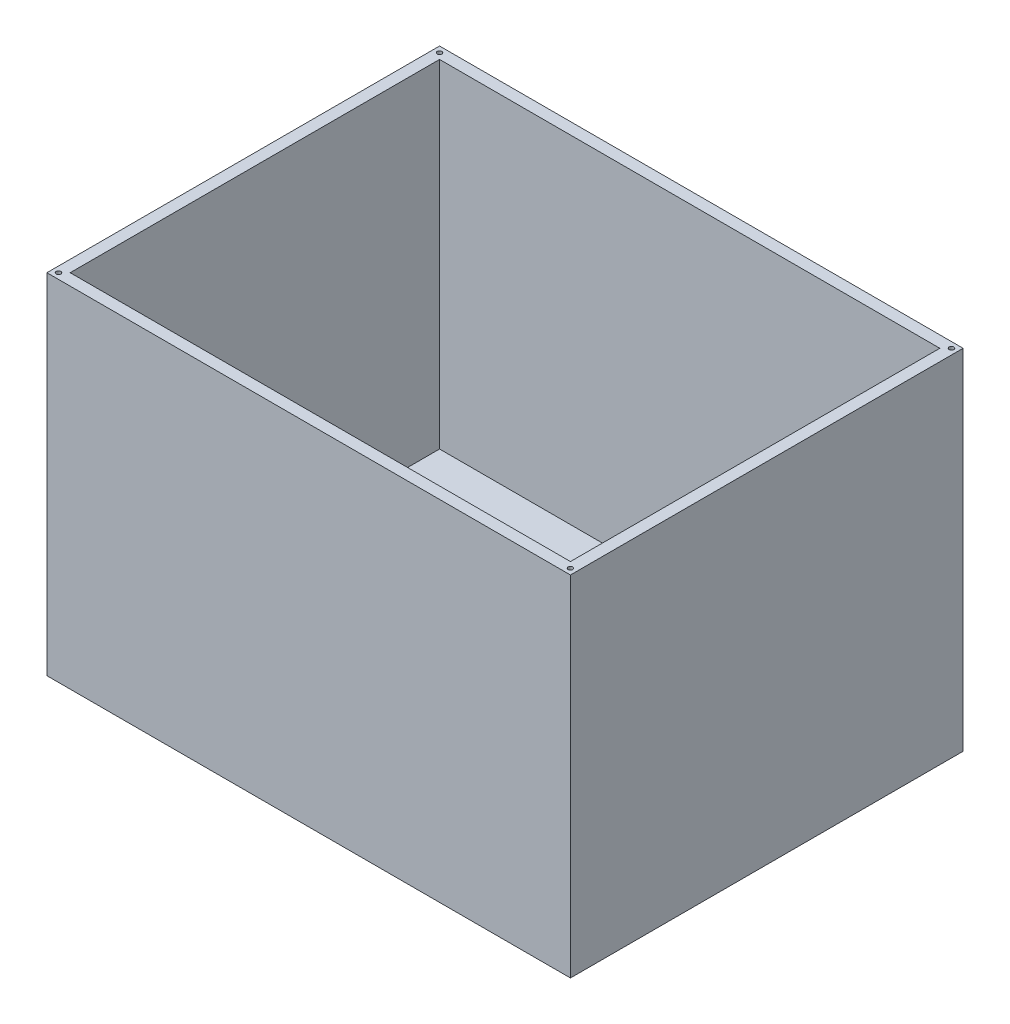
ISO-10303-21;
HEADER;
FILE_DESCRIPTION(('STEP AP214'),'2;1');
FILE_NAME('part.step','',(''),(''),'','','');
FILE_SCHEMA(('AUTOMOTIVE_DESIGN { 1 0 10303 214 1 1 1 1 }'));
ENDSEC;
DATA;
#1=APPLICATION_CONTEXT('core data for automotive mechanical design processes');
#2=APPLICATION_PROTOCOL_DEFINITION('international standard','automotive_design',2000,#1);
#3=PRODUCT_CONTEXT('',#1,'mechanical');
#4=PRODUCT('Part','Part','',(#3));
#5=PRODUCT_RELATED_PRODUCT_CATEGORY('part','',(#4));
#6=PRODUCT_DEFINITION_FORMATION('','',#4);
#7=PRODUCT_DEFINITION_CONTEXT('part definition',#1,'design');
#8=PRODUCT_DEFINITION('design','',#6,#7);
#9=PRODUCT_DEFINITION_SHAPE('','',#8);
#10=(LENGTH_UNIT() NAMED_UNIT(*) SI_UNIT(.MILLI.,.METRE.));
#11=(NAMED_UNIT(*) PLANE_ANGLE_UNIT() SI_UNIT($,.RADIAN.));
#12=(NAMED_UNIT(*) SI_UNIT($,.STERADIAN.) SOLID_ANGLE_UNIT());
#13=UNCERTAINTY_MEASURE_WITH_UNIT(LENGTH_MEASURE(1.E-05),#10,'distance_accuracy_value','');
#14=(GEOMETRIC_REPRESENTATION_CONTEXT(3) GLOBAL_UNCERTAINTY_ASSIGNED_CONTEXT((#13)) GLOBAL_UNIT_ASSIGNED_CONTEXT((#10,
#11,#12)) REPRESENTATION_CONTEXT('',''));
#15=CARTESIAN_POINT('',(0.,0.,0.));
#16=DIRECTION('',(0.,0.,1.));
#17=DIRECTION('',(1.,0.,0.));
#18=AXIS2_PLACEMENT_3D('',#15,#16,#17);
#19=CARTESIAN_POINT('',(450.,600.,-337.5));
#20=DIRECTION('',(-1.,0.,0.));
#21=DIRECTION('',(0.,0.,1.));
#22=AXIS2_PLACEMENT_3D('',#19,#20,#21);
#23=PLANE('',#22);
#24=DIRECTION('',(0.,0.,-1.));
#25=VECTOR('',#24,1.);
#26=CARTESIAN_POINT('',(450.,0.,-337.5));
#27=LINE('',#26,#25);
#28=CARTESIAN_POINT('',(450.,0.,337.5));
#29=VERTEX_POINT('',#28);
#30=CARTESIAN_POINT('',(450.,0.,-337.5));
#31=VERTEX_POINT('',#30);
#32=EDGE_CURVE('E147',#29,#31,#27,.T.);
#33=ORIENTED_EDGE('',*,*,#32,.T.);
#34=DIRECTION('',(0.,-1.,0.));
#35=VECTOR('',#34,1.);
#36=CARTESIAN_POINT('',(450.,600.,-337.5));
#37=LINE('',#36,#35);
#38=CARTESIAN_POINT('',(450.,600.,-337.5));
#39=VERTEX_POINT('',#38);
#40=EDGE_CURVE('E11',#39,#31,#37,.T.);
#41=ORIENTED_EDGE('',*,*,#40,.F.);
#42=DIRECTION('',(0.,0.,-1.));
#43=VECTOR('',#42,1.);
#44=CARTESIAN_POINT('',(450.,600.,-337.5));
#45=LINE('',#44,#43);
#46=CARTESIAN_POINT('',(450.,600.,337.5));
#47=VERTEX_POINT('',#46);
#48=EDGE_CURVE('E140',#47,#39,#45,.T.);
#49=ORIENTED_EDGE('',*,*,#48,.F.);
#50=DIRECTION('',(0.,-1.,0.));
#51=VECTOR('',#50,1.);
#52=CARTESIAN_POINT('',(450.,600.,337.5));
#53=LINE('',#52,#51);
#54=EDGE_CURVE('E146',#47,#29,#53,.T.);
#55=ORIENTED_EDGE('',*,*,#54,.T.);
#56=EDGE_LOOP('',(#33,#41,#49,#55));
#57=FACE_BOUND('',#56,.T.);
#58=ADVANCED_FACE('F33',(#57),#23,.F.);
#59=CARTESIAN_POINT('',(-450.,600.,-337.5));
#60=DIRECTION('',(0.,0.,1.));
#61=DIRECTION('',(1.,0.,0.));
#62=AXIS2_PLACEMENT_3D('',#59,#60,#61);
#63=PLANE('',#62);
#64=DIRECTION('',(-1.,0.,0.));
#65=VECTOR('',#64,1.);
#66=CARTESIAN_POINT('',(-450.,0.,-337.5));
#67=LINE('',#66,#65);
#68=CARTESIAN_POINT('',(-450.,0.,-337.5));
#69=VERTEX_POINT('',#68);
#70=EDGE_CURVE('E150',#31,#69,#67,.T.);
#71=ORIENTED_EDGE('',*,*,#70,.T.);
#72=DIRECTION('',(0.,-1.,0.));
#73=VECTOR('',#72,1.);
#74=CARTESIAN_POINT('',(-450.,600.,-337.5));
#75=LINE('',#74,#73);
#76=CARTESIAN_POINT('',(-450.,600.,-337.5));
#77=VERTEX_POINT('',#76);
#78=EDGE_CURVE('E40',#77,#69,#75,.T.);
#79=ORIENTED_EDGE('',*,*,#78,.F.);
#80=DIRECTION('',(-1.,0.,0.));
#81=VECTOR('',#80,1.);
#82=CARTESIAN_POINT('',(-450.,600.,-337.5));
#83=LINE('',#82,#81);
#84=EDGE_CURVE('E84',#39,#77,#83,.T.);
#85=ORIENTED_EDGE('',*,*,#84,.F.);
#86=ORIENTED_EDGE('',*,*,#40,.T.);
#87=EDGE_LOOP('',(#71,#79,#85,#86));
#88=FACE_BOUND('',#87,.T.);
#89=ADVANCED_FACE('F179',(#88),#63,.F.);
#90=CARTESIAN_POINT('',(-450.,600.,-337.5));
#91=DIRECTION('',(1.,0.,0.));
#92=DIRECTION('',(0.,0.,-1.));
#93=AXIS2_PLACEMENT_3D('',#90,#91,#92);
#94=PLANE('',#93);
#95=DIRECTION('',(0.,0.,1.));
#96=VECTOR('',#95,1.);
#97=CARTESIAN_POINT('',(-450.,0.,-337.5));
#98=LINE('',#97,#96);
#99=CARTESIAN_POINT('',(-450.,0.,337.5));
#100=VERTEX_POINT('',#99);
#101=EDGE_CURVE('E152',#69,#100,#98,.T.);
#102=ORIENTED_EDGE('',*,*,#101,.T.);
#103=DIRECTION('',(0.,-1.,0.));
#104=VECTOR('',#103,1.);
#105=CARTESIAN_POINT('',(-450.,600.,337.5));
#106=LINE('',#105,#104);
#107=CARTESIAN_POINT('',(-450.,600.,337.5));
#108=VERTEX_POINT('',#107);
#109=EDGE_CURVE('E156',#108,#100,#106,.T.);
#110=ORIENTED_EDGE('',*,*,#109,.F.);
#111=DIRECTION('',(0.,0.,1.));
#112=VECTOR('',#111,1.);
#113=CARTESIAN_POINT('',(-450.,600.,-337.5));
#114=LINE('',#113,#112);
#115=EDGE_CURVE('E143',#77,#108,#114,.T.);
#116=ORIENTED_EDGE('',*,*,#115,.F.);
#117=ORIENTED_EDGE('',*,*,#78,.T.);
#118=EDGE_LOOP('',(#102,#110,#116,#117));
#119=FACE_BOUND('',#118,.T.);
#120=ADVANCED_FACE('F161',(#119),#94,.F.);
#121=CARTESIAN_POINT('',(-450.,600.,337.5));
#122=DIRECTION('',(0.,0.,-1.));
#123=DIRECTION('',(-1.,0.,0.));
#124=AXIS2_PLACEMENT_3D('',#121,#122,#123);
#125=PLANE('',#124);
#126=DIRECTION('',(1.,0.,0.));
#127=VECTOR('',#126,1.);
#128=CARTESIAN_POINT('',(-450.,0.,337.5));
#129=LINE('',#128,#127);
#130=EDGE_CURVE('E77',#100,#29,#129,.T.);
#131=ORIENTED_EDGE('',*,*,#130,.T.);
#132=ORIENTED_EDGE('',*,*,#54,.F.);
#133=DIRECTION('',(1.,0.,0.));
#134=VECTOR('',#133,1.);
#135=CARTESIAN_POINT('',(-450.,600.,337.5));
#136=LINE('',#135,#134);
#137=EDGE_CURVE('E56',#108,#47,#136,.T.);
#138=ORIENTED_EDGE('',*,*,#137,.F.);
#139=ORIENTED_EDGE('',*,*,#109,.T.);
#140=EDGE_LOOP('',(#131,#132,#138,#139));
#141=FACE_BOUND('',#140,.T.);
#142=ADVANCED_FACE('F169',(#141),#125,.F.);
#143=CARTESIAN_POINT('',(0.,600.,0.));
#144=DIRECTION('',(0.,1.,0.));
#145=DIRECTION('',(0.,0.,1.));
#146=AXIS2_PLACEMENT_3D('',#143,#144,#145);
#147=PLANE('',#146);
#148=CARTESIAN_POINT('',(-440.,600.,-327.5));
#149=DIRECTION('',(0.,1.,0.));
#150=DIRECTION('',(0.,0.,1.));
#151=AXIS2_PLACEMENT_3D('',#148,#149,#150);
#152=CIRCLE('',#151,3.99999999999999);
#153=CARTESIAN_POINT('',(-440.,600.,-323.5));
#154=VERTEX_POINT('',#153);
#155=EDGE_CURVE('E340',#154,#154,#152,.T.);
#156=ORIENTED_EDGE('',*,*,#155,.F.);
#157=EDGE_LOOP('',(#156));
#158=FACE_BOUND('',#157,.T.);
#159=CARTESIAN_POINT('',(440.,600.,-327.5));
#160=DIRECTION('',(0.,1.,0.));
#161=DIRECTION('',(0.,0.,1.));
#162=AXIS2_PLACEMENT_3D('',#159,#160,#161);
#163=CIRCLE('',#162,3.99999999999999);
#164=CARTESIAN_POINT('',(440.,600.,-323.5));
#165=VERTEX_POINT('',#164);
#166=EDGE_CURVE('E339',#165,#165,#163,.T.);
#167=ORIENTED_EDGE('',*,*,#166,.F.);
#168=EDGE_LOOP('',(#167));
#169=FACE_BOUND('',#168,.T.);
#170=CARTESIAN_POINT('',(440.,600.,327.5));
#171=DIRECTION('',(0.,1.,0.));
#172=DIRECTION('',(0.,0.,1.));
#173=AXIS2_PLACEMENT_3D('',#170,#171,#172);
#174=CIRCLE('',#173,3.99999999999999);
#175=CARTESIAN_POINT('',(440.,600.,331.5));
#176=VERTEX_POINT('',#175);
#177=EDGE_CURVE('E349',#176,#176,#174,.T.);
#178=ORIENTED_EDGE('',*,*,#177,.F.);
#179=EDGE_LOOP('',(#178));
#180=FACE_BOUND('',#179,.T.);
#181=CARTESIAN_POINT('',(-440.,600.,327.5));
#182=DIRECTION('',(0.,1.,0.));
#183=DIRECTION('',(0.,0.,1.));
#184=AXIS2_PLACEMENT_3D('',#181,#182,#183);
#185=CIRCLE('',#184,3.99999999999999);
#186=CARTESIAN_POINT('',(-440.,600.,331.5));
#187=VERTEX_POINT('',#186);
#188=EDGE_CURVE('E354',#187,#187,#185,.T.);
#189=ORIENTED_EDGE('',*,*,#188,.F.);
#190=EDGE_LOOP('',(#189));
#191=FACE_BOUND('',#190,.T.);
#192=DIRECTION('',(0.,0.,-1.));
#193=VECTOR('',#192,1.);
#194=CARTESIAN_POINT('',(430.,600.,-337.5));
#195=LINE('',#194,#193);
#196=CARTESIAN_POINT('',(430.,600.,317.5));
#197=VERTEX_POINT('',#196);
#198=CARTESIAN_POINT('',(430.,600.,-317.5));
#199=VERTEX_POINT('',#198);
#200=EDGE_CURVE('E129',#197,#199,#195,.T.);
#201=ORIENTED_EDGE('',*,*,#200,.F.);
#202=DIRECTION('',(1.,0.,0.));
#203=VECTOR('',#202,1.);
#204=CARTESIAN_POINT('',(-450.,600.,317.5));
#205=LINE('',#204,#203);
#206=CARTESIAN_POINT('',(-430.,600.,317.5));
#207=VERTEX_POINT('',#206);
#208=EDGE_CURVE('E138',#207,#197,#205,.T.);
#209=ORIENTED_EDGE('',*,*,#208,.F.);
#210=DIRECTION('',(0.,0.,1.));
#211=VECTOR('',#210,1.);
#212=CARTESIAN_POINT('',(-430.,600.,-337.5));
#213=LINE('',#212,#211);
#214=CARTESIAN_POINT('',(-430.,600.,-317.5));
#215=VERTEX_POINT('',#214);
#216=EDGE_CURVE('E136',#215,#207,#213,.T.);
#217=ORIENTED_EDGE('',*,*,#216,.F.);
#218=DIRECTION('',(-1.,0.,0.));
#219=VECTOR('',#218,1.);
#220=CARTESIAN_POINT('',(-450.,600.,-317.5));
#221=LINE('',#220,#219);
#222=EDGE_CURVE('E121',#199,#215,#221,.T.);
#223=ORIENTED_EDGE('',*,*,#222,.F.);
#224=EDGE_LOOP('',(#201,#209,#217,#223));
#225=FACE_BOUND('',#224,.T.);
#226=ORIENTED_EDGE('',*,*,#48,.T.);
#227=ORIENTED_EDGE('',*,*,#84,.T.);
#228=ORIENTED_EDGE('',*,*,#115,.T.);
#229=ORIENTED_EDGE('',*,*,#137,.T.);
#230=EDGE_LOOP('',(#226,#227,#228,#229));
#231=FACE_BOUND('',#230,.T.);
#232=ADVANCED_FACE('F171',(#158,#169,#180,#191,#225,#231),#147,.T.);
#233=CARTESIAN_POINT('',(0.,0.,0.));
#234=DIRECTION('',(0.,1.,0.));
#235=DIRECTION('',(0.,0.,1.));
#236=AXIS2_PLACEMENT_3D('',#233,#234,#235);
#237=PLANE('',#236);
#238=ORIENTED_EDGE('',*,*,#32,.F.);
#239=ORIENTED_EDGE('',*,*,#130,.F.);
#240=ORIENTED_EDGE('',*,*,#101,.F.);
#241=ORIENTED_EDGE('',*,*,#70,.F.);
#242=EDGE_LOOP('',(#238,#239,#240,#241));
#243=FACE_BOUND('',#242,.T.);
#244=ADVANCED_FACE('F165',(#243),#237,.F.);
#245=CARTESIAN_POINT('',(430.,600.,-337.5));
#246=DIRECTION('',(-1.,0.,0.));
#247=DIRECTION('',(0.,0.,1.));
#248=AXIS2_PLACEMENT_3D('',#245,#246,#247);
#249=PLANE('',#248);
#250=DIRECTION('',(0.,0.,-1.));
#251=VECTOR('',#250,1.);
#252=CARTESIAN_POINT('',(430.,20.,-337.5));
#253=LINE('',#252,#251);
#254=CARTESIAN_POINT('',(430.,20.,317.5));
#255=VERTEX_POINT('',#254);
#256=CARTESIAN_POINT('',(430.,20.,-317.5));
#257=VERTEX_POINT('',#256);
#258=EDGE_CURVE('E112',#255,#257,#253,.T.);
#259=ORIENTED_EDGE('',*,*,#258,.F.);
#260=DIRECTION('',(0.,-1.,0.));
#261=VECTOR('',#260,1.);
#262=CARTESIAN_POINT('',(430.,600.,317.5));
#263=LINE('',#262,#261);
#264=EDGE_CURVE('E132',#197,#255,#263,.T.);
#265=ORIENTED_EDGE('',*,*,#264,.F.);
#266=ORIENTED_EDGE('',*,*,#200,.T.);
#267=DIRECTION('',(0.,-1.,0.));
#268=VECTOR('',#267,1.);
#269=CARTESIAN_POINT('',(430.,600.,-317.5));
#270=LINE('',#269,#268);
#271=EDGE_CURVE('E124',#199,#257,#270,.T.);
#272=ORIENTED_EDGE('',*,*,#271,.T.);
#273=EDGE_LOOP('',(#259,#265,#266,#272));
#274=FACE_BOUND('',#273,.T.);
#275=ADVANCED_FACE('F206',(#274),#249,.T.);
#276=CARTESIAN_POINT('',(-450.,600.,-317.5));
#277=DIRECTION('',(0.,0.,1.));
#278=DIRECTION('',(1.,0.,0.));
#279=AXIS2_PLACEMENT_3D('',#276,#277,#278);
#280=PLANE('',#279);
#281=DIRECTION('',(-1.,0.,0.));
#282=VECTOR('',#281,1.);
#283=CARTESIAN_POINT('',(-450.,20.,-317.5));
#284=LINE('',#283,#282);
#285=CARTESIAN_POINT('',(-430.,20.,-317.5));
#286=VERTEX_POINT('',#285);
#287=EDGE_CURVE('E106',#257,#286,#284,.T.);
#288=ORIENTED_EDGE('',*,*,#287,.F.);
#289=ORIENTED_EDGE('',*,*,#271,.F.);
#290=ORIENTED_EDGE('',*,*,#222,.T.);
#291=DIRECTION('',(0.,-1.,0.));
#292=VECTOR('',#291,1.);
#293=CARTESIAN_POINT('',(-430.,600.,-317.5));
#294=LINE('',#293,#292);
#295=EDGE_CURVE('E118',#215,#286,#294,.T.);
#296=ORIENTED_EDGE('',*,*,#295,.T.);
#297=EDGE_LOOP('',(#288,#289,#290,#296));
#298=FACE_BOUND('',#297,.T.);
#299=ADVANCED_FACE('F119',(#298),#280,.T.);
#300=CARTESIAN_POINT('',(-430.,600.,-337.5));
#301=DIRECTION('',(1.,0.,0.));
#302=DIRECTION('',(0.,0.,-1.));
#303=AXIS2_PLACEMENT_3D('',#300,#301,#302);
#304=PLANE('',#303);
#305=DIRECTION('',(0.,0.,1.));
#306=VECTOR('',#305,1.);
#307=CARTESIAN_POINT('',(-430.,20.,-337.5));
#308=LINE('',#307,#306);
#309=CARTESIAN_POINT('',(-430.,20.,317.5));
#310=VERTEX_POINT('',#309);
#311=EDGE_CURVE('E110',#286,#310,#308,.T.);
#312=ORIENTED_EDGE('',*,*,#311,.F.);
#313=ORIENTED_EDGE('',*,*,#295,.F.);
#314=ORIENTED_EDGE('',*,*,#216,.T.);
#315=DIRECTION('',(0.,-1.,0.));
#316=VECTOR('',#315,1.);
#317=CARTESIAN_POINT('',(-430.,600.,317.5));
#318=LINE('',#317,#316);
#319=EDGE_CURVE('E47',#207,#310,#318,.T.);
#320=ORIENTED_EDGE('',*,*,#319,.T.);
#321=EDGE_LOOP('',(#312,#313,#314,#320));
#322=FACE_BOUND('',#321,.T.);
#323=ADVANCED_FACE('F126',(#322),#304,.T.);
#324=CARTESIAN_POINT('',(-450.,600.,317.5));
#325=DIRECTION('',(0.,0.,-1.));
#326=DIRECTION('',(-1.,0.,0.));
#327=AXIS2_PLACEMENT_3D('',#324,#325,#326);
#328=PLANE('',#327);
#329=DIRECTION('',(1.,0.,0.));
#330=VECTOR('',#329,1.);
#331=CARTESIAN_POINT('',(-450.,20.,317.5));
#332=LINE('',#331,#330);
#333=EDGE_CURVE('E127',#310,#255,#332,.T.);
#334=ORIENTED_EDGE('',*,*,#333,.F.);
#335=ORIENTED_EDGE('',*,*,#319,.F.);
#336=ORIENTED_EDGE('',*,*,#208,.T.);
#337=ORIENTED_EDGE('',*,*,#264,.T.);
#338=EDGE_LOOP('',(#334,#335,#336,#337));
#339=FACE_BOUND('',#338,.T.);
#340=ADVANCED_FACE('F231',(#339),#328,.T.);
#341=CARTESIAN_POINT('',(0.,20.,0.));
#342=DIRECTION('',(0.,1.,0.));
#343=DIRECTION('',(0.,0.,1.));
#344=AXIS2_PLACEMENT_3D('',#341,#342,#343);
#345=PLANE('',#344);
#346=ORIENTED_EDGE('',*,*,#258,.T.);
#347=ORIENTED_EDGE('',*,*,#287,.T.);
#348=ORIENTED_EDGE('',*,*,#311,.T.);
#349=ORIENTED_EDGE('',*,*,#333,.T.);
#350=EDGE_LOOP('',(#346,#347,#348,#349));
#351=FACE_BOUND('',#350,.T.);
#352=ADVANCED_FACE('F108',(#351),#345,.T.);
#353=CARTESIAN_POINT('',(-440.,580.,327.5));
#354=DIRECTION('',(0.,1.,0.));
#355=DIRECTION('',(0.,0.,1.));
#356=AXIS2_PLACEMENT_3D('',#353,#354,#355);
#357=CYLINDRICAL_SURFACE('',#356,3.99999999999999);
#358=CARTESIAN_POINT('',(-440.,580.,327.5));
#359=DIRECTION('',(0.,1.,0.));
#360=DIRECTION('',(0.,0.,1.));
#361=AXIS2_PLACEMENT_3D('',#358,#359,#360);
#362=CIRCLE('',#361,3.99999999999999);
#363=CARTESIAN_POINT('',(-440.,580.,331.5));
#364=VERTEX_POINT('',#363);
#365=EDGE_CURVE('E357',#364,#364,#362,.T.);
#366=ORIENTED_EDGE('',*,*,#365,.F.);
#367=EDGE_LOOP('',(#366));
#368=FACE_BOUND('',#367,.T.);
#369=ORIENTED_EDGE('',*,*,#188,.T.);
#370=EDGE_LOOP('',(#369));
#371=FACE_BOUND('',#370,.T.);
#372=ADVANCED_FACE('F248',(#368,#371),#357,.F.);
#373=CARTESIAN_POINT('',(-440.,580.,327.5));
#374=DIRECTION('',(0.,1.,0.));
#375=DIRECTION('',(0.,0.,1.));
#376=AXIS2_PLACEMENT_3D('',#373,#374,#375);
#377=PLANE('',#376);
#378=ORIENTED_EDGE('',*,*,#365,.T.);
#379=EDGE_LOOP('',(#378));
#380=FACE_BOUND('',#379,.T.);
#381=ADVANCED_FACE('F257',(#380),#377,.T.);
#382=CARTESIAN_POINT('',(440.,580.,327.5));
#383=DIRECTION('',(0.,1.,0.));
#384=DIRECTION('',(0.,0.,1.));
#385=AXIS2_PLACEMENT_3D('',#382,#383,#384);
#386=CYLINDRICAL_SURFACE('',#385,3.99999999999999);
#387=CARTESIAN_POINT('',(440.,580.,327.5));
#388=DIRECTION('',(0.,1.,0.));
#389=DIRECTION('',(0.,0.,1.));
#390=AXIS2_PLACEMENT_3D('',#387,#388,#389);
#391=CIRCLE('',#390,3.99999999999999);
#392=CARTESIAN_POINT('',(440.,580.,331.5));
#393=VERTEX_POINT('',#392);
#394=EDGE_CURVE('E351',#393,#393,#391,.T.);
#395=ORIENTED_EDGE('',*,*,#394,.F.);
#396=EDGE_LOOP('',(#395));
#397=FACE_BOUND('',#396,.T.);
#398=ORIENTED_EDGE('',*,*,#177,.T.);
#399=EDGE_LOOP('',(#398));
#400=FACE_BOUND('',#399,.T.);
#401=ADVANCED_FACE('F267',(#397,#400),#386,.F.);
#402=CARTESIAN_POINT('',(440.,580.,327.5));
#403=DIRECTION('',(0.,1.,0.));
#404=DIRECTION('',(0.,0.,1.));
#405=AXIS2_PLACEMENT_3D('',#402,#403,#404);
#406=PLANE('',#405);
#407=ORIENTED_EDGE('',*,*,#394,.T.);
#408=EDGE_LOOP('',(#407));
#409=FACE_BOUND('',#408,.T.);
#410=ADVANCED_FACE('F277',(#409),#406,.T.);
#411=CARTESIAN_POINT('',(440.,580.,-327.5));
#412=DIRECTION('',(0.,1.,0.));
#413=DIRECTION('',(0.,0.,1.));
#414=AXIS2_PLACEMENT_3D('',#411,#412,#413);
#415=CYLINDRICAL_SURFACE('',#414,3.99999999999999);
#416=CARTESIAN_POINT('',(440.,580.,-327.5));
#417=DIRECTION('',(0.,1.,0.));
#418=DIRECTION('',(0.,0.,1.));
#419=AXIS2_PLACEMENT_3D('',#416,#417,#418);
#420=CIRCLE('',#419,3.99999999999999);
#421=CARTESIAN_POINT('',(440.,580.,-323.5));
#422=VERTEX_POINT('',#421);
#423=EDGE_CURVE('E343',#422,#422,#420,.T.);
#424=ORIENTED_EDGE('',*,*,#423,.F.);
#425=EDGE_LOOP('',(#424));
#426=FACE_BOUND('',#425,.T.);
#427=ORIENTED_EDGE('',*,*,#166,.T.);
#428=EDGE_LOOP('',(#427));
#429=FACE_BOUND('',#428,.T.);
#430=ADVANCED_FACE('F287',(#426,#429),#415,.F.);
#431=CARTESIAN_POINT('',(440.,580.,-327.5));
#432=DIRECTION('',(0.,1.,0.));
#433=DIRECTION('',(0.,0.,1.));
#434=AXIS2_PLACEMENT_3D('',#431,#432,#433);
#435=PLANE('',#434);
#436=ORIENTED_EDGE('',*,*,#423,.T.);
#437=EDGE_LOOP('',(#436));
#438=FACE_BOUND('',#437,.T.);
#439=ADVANCED_FACE('F297',(#438),#435,.T.);
#440=CARTESIAN_POINT('',(-440.,580.,-327.5));
#441=DIRECTION('',(0.,1.,0.));
#442=DIRECTION('',(0.,0.,1.));
#443=AXIS2_PLACEMENT_3D('',#440,#441,#442);
#444=CYLINDRICAL_SURFACE('',#443,3.99999999999999);
#445=CARTESIAN_POINT('',(-440.,580.,-327.5));
#446=DIRECTION('',(0.,1.,0.));
#447=DIRECTION('',(0.,0.,1.));
#448=AXIS2_PLACEMENT_3D('',#445,#446,#447);
#449=CIRCLE('',#448,3.99999999999999);
#450=CARTESIAN_POINT('',(-440.,580.,-323.5));
#451=VERTEX_POINT('',#450);
#452=EDGE_CURVE('E338',#451,#451,#449,.T.);
#453=ORIENTED_EDGE('',*,*,#452,.F.);
#454=EDGE_LOOP('',(#453));
#455=FACE_BOUND('',#454,.T.);
#456=ORIENTED_EDGE('',*,*,#155,.T.);
#457=EDGE_LOOP('',(#456));
#458=FACE_BOUND('',#457,.T.);
#459=ADVANCED_FACE('F307',(#455,#458),#444,.F.);
#460=CARTESIAN_POINT('',(-440.,580.,-327.5));
#461=DIRECTION('',(0.,1.,0.));
#462=DIRECTION('',(0.,0.,1.));
#463=AXIS2_PLACEMENT_3D('',#460,#461,#462);
#464=PLANE('',#463);
#465=ORIENTED_EDGE('',*,*,#452,.T.);
#466=EDGE_LOOP('',(#465));
#467=FACE_BOUND('',#466,.T.);
#468=ADVANCED_FACE('F322',(#467),#464,.T.);
#469=CLOSED_SHELL('',(#58,#89,#120,#142,#232,#244,#275,#299,#323,#340,#352,#372,#381,#401,#410,
#430,#439,#459,#468));
#470=MANIFOLD_SOLID_BREP('B2',#469);
#471=ADVANCED_BREP_SHAPE_REPRESENTATION('',(#18,#470),#14);
#472=SHAPE_DEFINITION_REPRESENTATION(#9,#471);
ENDSEC;
END-ISO-10303-21;
